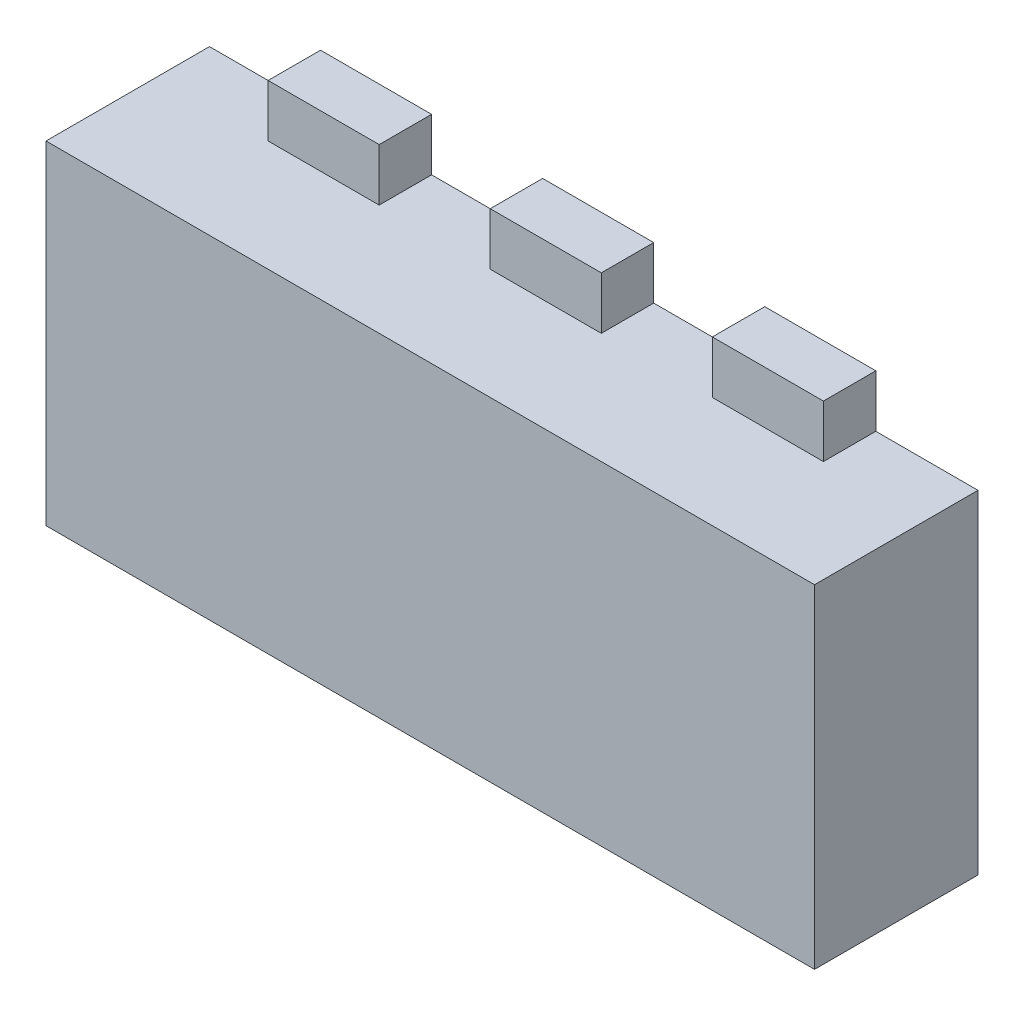
ISO-10303-21;
HEADER;
FILE_DESCRIPTION(('STEP AP214'),'2;1');
FILE_NAME('part.step','',(''),(''),'','','');
FILE_SCHEMA(('AUTOMOTIVE_DESIGN { 1 0 10303 214 1 1 1 1 }'));
ENDSEC;
DATA;
#1=APPLICATION_CONTEXT('core data for automotive mechanical design processes');
#2=APPLICATION_PROTOCOL_DEFINITION('international standard','automotive_design',2000,#1);
#3=PRODUCT_CONTEXT('',#1,'mechanical');
#4=PRODUCT('Part','Part','',(#3));
#5=PRODUCT_RELATED_PRODUCT_CATEGORY('part','',(#4));
#6=PRODUCT_DEFINITION_FORMATION('','',#4);
#7=PRODUCT_DEFINITION_CONTEXT('part definition',#1,'design');
#8=PRODUCT_DEFINITION('design','',#6,#7);
#9=PRODUCT_DEFINITION_SHAPE('','',#8);
#10=(LENGTH_UNIT() NAMED_UNIT(*) SI_UNIT(.MILLI.,.METRE.));
#11=(NAMED_UNIT(*) PLANE_ANGLE_UNIT() SI_UNIT($,.RADIAN.));
#12=(NAMED_UNIT(*) SI_UNIT($,.STERADIAN.) SOLID_ANGLE_UNIT());
#13=UNCERTAINTY_MEASURE_WITH_UNIT(LENGTH_MEASURE(1.E-05),#10,'distance_accuracy_value','');
#14=(GEOMETRIC_REPRESENTATION_CONTEXT(3) GLOBAL_UNCERTAINTY_ASSIGNED_CONTEXT((#13)) GLOBAL_UNIT_ASSIGNED_CONTEXT((#10,
#11,#12)) REPRESENTATION_CONTEXT('',''));
#15=CARTESIAN_POINT('',(0.,0.,0.));
#16=DIRECTION('',(0.,0.,1.));
#17=DIRECTION('',(1.,0.,0.));
#18=AXIS2_PLACEMENT_3D('',#15,#16,#17);
#19=CARTESIAN_POINT('',(0.,0.,2.9972));
#20=DIRECTION('',(0.,0.,-1.));
#21=DIRECTION('',(-1.,0.,0.));
#22=AXIS2_PLACEMENT_3D('',#19,#20,#21);
#23=PLANE('',#22);
#24=DIRECTION('',(-1.,0.,0.));
#25=VECTOR('',#24,1.);
#26=CARTESIAN_POINT('',(-21.971,9.525,2.9972));
#27=LINE('',#26,#25);
#28=CARTESIAN_POINT('',(16.129,9.525,2.9972));
#29=VERTEX_POINT('',#28);
#30=CARTESIAN_POINT('',(9.77899999999999,9.525,2.9972));
#31=VERTEX_POINT('',#30);
#32=EDGE_CURVE('E11',#29,#31,#27,.T.);
#33=ORIENTED_EDGE('',*,*,#32,.F.);
#34=DIRECTION('',(0.,-1.,0.));
#35=VECTOR('',#34,1.);
#36=CARTESIAN_POINT('',(16.129,12.5222,2.9972));
#37=LINE('',#36,#35);
#38=CARTESIAN_POINT('',(16.129,12.5222,2.9972));
#39=VERTEX_POINT('',#38);
#40=EDGE_CURVE('E397',#39,#29,#37,.T.);
#41=ORIENTED_EDGE('',*,*,#40,.F.);
#42=DIRECTION('',(1.,0.,0.));
#43=VECTOR('',#42,1.);
#44=CARTESIAN_POINT('',(9.779,12.5222,2.9972));
#45=LINE('',#44,#43);
#46=CARTESIAN_POINT('',(9.779,12.5222,2.9972));
#47=VERTEX_POINT('',#46);
#48=EDGE_CURVE('E380',#47,#39,#45,.T.);
#49=ORIENTED_EDGE('',*,*,#48,.F.);
#50=DIRECTION('',(0.,-1.,0.));
#51=VECTOR('',#50,1.);
#52=CARTESIAN_POINT('',(9.779,12.5222,2.9972));
#53=LINE('',#52,#51);
#54=EDGE_CURVE('E363',#47,#31,#53,.T.);
#55=ORIENTED_EDGE('',*,*,#54,.T.);
#56=EDGE_LOOP('',(#33,#41,#49,#55));
#57=FACE_BOUND('',#56,.T.);
#58=ADVANCED_FACE('F47',(#57),#23,.F.);
#59=CARTESIAN_POINT('',(3.42899999999999,9.525,2.9972));
#60=VERTEX_POINT('',#59);
#61=CARTESIAN_POINT('',(-2.92100000000001,9.525,2.9972));
#62=VERTEX_POINT('',#61);
#63=EDGE_CURVE('E56',#60,#62,#27,.T.);
#64=ORIENTED_EDGE('',*,*,#63,.F.);
#65=DIRECTION('',(0.,-1.,0.));
#66=VECTOR('',#65,1.);
#67=CARTESIAN_POINT('',(3.429,12.5222,2.9972));
#68=LINE('',#67,#66);
#69=CARTESIAN_POINT('',(3.429,12.5222,2.9972));
#70=VERTEX_POINT('',#69);
#71=EDGE_CURVE('E371',#70,#60,#68,.T.);
#72=ORIENTED_EDGE('',*,*,#71,.F.);
#73=DIRECTION('',(1.,0.,0.));
#74=VECTOR('',#73,1.);
#75=CARTESIAN_POINT('',(-2.921,12.5222,2.9972));
#76=LINE('',#75,#74);
#77=CARTESIAN_POINT('',(-2.921,12.5222,2.9972));
#78=VERTEX_POINT('',#77);
#79=EDGE_CURVE('E352',#78,#70,#76,.T.);
#80=ORIENTED_EDGE('',*,*,#79,.F.);
#81=DIRECTION('',(0.,-1.,0.));
#82=VECTOR('',#81,1.);
#83=CARTESIAN_POINT('',(-2.921,12.5222,2.9972));
#84=LINE('',#83,#82);
#85=EDGE_CURVE('E374',#78,#62,#84,.T.);
#86=ORIENTED_EDGE('',*,*,#85,.T.);
#87=EDGE_LOOP('',(#64,#72,#80,#86));
#88=FACE_BOUND('',#87,.T.);
#89=ADVANCED_FACE('F470',(#88),#23,.F.);
#90=CARTESIAN_POINT('',(-9.271,9.525,2.9972));
#91=VERTEX_POINT('',#90);
#92=CARTESIAN_POINT('',(-15.621,9.525,2.9972));
#93=VERTEX_POINT('',#92);
#94=EDGE_CURVE('E58',#91,#93,#27,.T.);
#95=ORIENTED_EDGE('',*,*,#94,.F.);
#96=DIRECTION('',(0.,-1.,0.));
#97=VECTOR('',#96,1.);
#98=CARTESIAN_POINT('',(-9.271,12.5222,2.9972));
#99=LINE('',#98,#97);
#100=CARTESIAN_POINT('',(-9.271,12.5222,2.9972));
#101=VERTEX_POINT('',#100);
#102=EDGE_CURVE('E421',#101,#91,#99,.T.);
#103=ORIENTED_EDGE('',*,*,#102,.F.);
#104=DIRECTION('',(1.,0.,0.));
#105=VECTOR('',#104,1.);
#106=CARTESIAN_POINT('',(-15.621,12.5222,2.9972));
#107=LINE('',#106,#105);
#108=CARTESIAN_POINT('',(-15.621,12.5222,2.9972));
#109=VERTEX_POINT('',#108);
#110=EDGE_CURVE('E404',#109,#101,#107,.T.);
#111=ORIENTED_EDGE('',*,*,#110,.F.);
#112=DIRECTION('',(0.,-1.,0.));
#113=VECTOR('',#112,1.);
#114=CARTESIAN_POINT('',(-15.621,12.5222,2.9972));
#115=LINE('',#114,#113);
#116=EDGE_CURVE('E424',#109,#93,#115,.T.);
#117=ORIENTED_EDGE('',*,*,#116,.T.);
#118=EDGE_LOOP('',(#95,#103,#111,#117));
#119=FACE_BOUND('',#118,.T.);
#120=ADVANCED_FACE('F479',(#119),#23,.F.);
#121=DIRECTION('',(1.,0.,0.));
#122=VECTOR('',#121,1.);
#123=CARTESIAN_POINT('',(-21.971,-9.525,2.9972));
#124=LINE('',#123,#122);
#125=CARTESIAN_POINT('',(-15.621,-9.525,2.9972));
#126=VERTEX_POINT('',#125);
#127=CARTESIAN_POINT('',(-9.271,-9.525,2.9972));
#128=VERTEX_POINT('',#127);
#129=EDGE_CURVE('E269',#126,#128,#124,.T.);
#130=ORIENTED_EDGE('',*,*,#129,.F.);
#131=DIRECTION('',(0.,1.,0.));
#132=VECTOR('',#131,1.);
#133=CARTESIAN_POINT('',(-15.621,-12.5222,2.9972));
#134=LINE('',#133,#132);
#135=CARTESIAN_POINT('',(-15.621,-12.5222,2.9972));
#136=VERTEX_POINT('',#135);
#137=EDGE_CURVE('E287',#136,#126,#134,.T.);
#138=ORIENTED_EDGE('',*,*,#137,.F.);
#139=DIRECTION('',(1.,0.,0.));
#140=VECTOR('',#139,1.);
#141=CARTESIAN_POINT('',(-15.621,-12.5222,2.9972));
#142=LINE('',#141,#140);
#143=CARTESIAN_POINT('',(-9.271,-12.5222,2.9972));
#144=VERTEX_POINT('',#143);
#145=EDGE_CURVE('E284',#136,#144,#142,.T.);
#146=ORIENTED_EDGE('',*,*,#145,.T.);
#147=DIRECTION('',(0.,1.,0.));
#148=VECTOR('',#147,1.);
#149=CARTESIAN_POINT('',(-9.271,-12.5222,2.9972));
#150=LINE('',#149,#148);
#151=EDGE_CURVE('E296',#144,#128,#150,.T.);
#152=ORIENTED_EDGE('',*,*,#151,.T.);
#153=EDGE_LOOP('',(#130,#138,#146,#152));
#154=FACE_BOUND('',#153,.T.);
#155=ADVANCED_FACE('F490',(#154),#23,.F.);
#156=CARTESIAN_POINT('',(-2.921,-9.525,2.9972));
#157=VERTEX_POINT('',#156);
#158=CARTESIAN_POINT('',(3.429,-9.525,2.9972));
#159=VERTEX_POINT('',#158);
#160=EDGE_CURVE('E271',#157,#159,#124,.T.);
#161=ORIENTED_EDGE('',*,*,#160,.F.);
#162=DIRECTION('',(0.,1.,0.));
#163=VECTOR('',#162,1.);
#164=CARTESIAN_POINT('',(-2.921,-12.5222,2.9972));
#165=LINE('',#164,#163);
#166=CARTESIAN_POINT('',(-2.921,-12.5222,2.9972));
#167=VERTEX_POINT('',#166);
#168=EDGE_CURVE('E315',#167,#157,#165,.T.);
#169=ORIENTED_EDGE('',*,*,#168,.F.);
#170=DIRECTION('',(1.,0.,0.));
#171=VECTOR('',#170,1.);
#172=CARTESIAN_POINT('',(-2.921,-12.5222,2.9972));
#173=LINE('',#172,#171);
#174=CARTESIAN_POINT('',(3.429,-12.5222,2.9972));
#175=VERTEX_POINT('',#174);
#176=EDGE_CURVE('E312',#167,#175,#173,.T.);
#177=ORIENTED_EDGE('',*,*,#176,.T.);
#178=DIRECTION('',(0.,1.,0.));
#179=VECTOR('',#178,1.);
#180=CARTESIAN_POINT('',(3.429,-12.5222,2.9972));
#181=LINE('',#180,#179);
#182=EDGE_CURVE('E323',#175,#159,#181,.T.);
#183=ORIENTED_EDGE('',*,*,#182,.T.);
#184=EDGE_LOOP('',(#161,#169,#177,#183));
#185=FACE_BOUND('',#184,.T.);
#186=ADVANCED_FACE('F448',(#185),#23,.F.);
#187=CARTESIAN_POINT('',(9.779,-9.525,2.9972));
#188=VERTEX_POINT('',#187);
#189=CARTESIAN_POINT('',(16.129,-9.525,2.9972));
#190=VERTEX_POINT('',#189);
#191=EDGE_CURVE('E272',#188,#190,#124,.T.);
#192=ORIENTED_EDGE('',*,*,#191,.F.);
#193=DIRECTION('',(0.,1.,0.));
#194=VECTOR('',#193,1.);
#195=CARTESIAN_POINT('',(9.779,-12.5222,2.9972));
#196=LINE('',#195,#194);
#197=CARTESIAN_POINT('',(9.779,-12.5222,2.9972));
#198=VERTEX_POINT('',#197);
#199=EDGE_CURVE('E339',#198,#188,#196,.T.);
#200=ORIENTED_EDGE('',*,*,#199,.F.);
#201=DIRECTION('',(1.,0.,0.));
#202=VECTOR('',#201,1.);
#203=CARTESIAN_POINT('',(9.779,-12.5222,2.9972));
#204=LINE('',#203,#202);
#205=CARTESIAN_POINT('',(16.129,-12.5222,2.9972));
#206=VERTEX_POINT('',#205);
#207=EDGE_CURVE('E336',#198,#206,#204,.T.);
#208=ORIENTED_EDGE('',*,*,#207,.T.);
#209=DIRECTION('',(0.,1.,0.));
#210=VECTOR('',#209,1.);
#211=CARTESIAN_POINT('',(16.129,-12.5222,2.9972));
#212=LINE('',#211,#210);
#213=EDGE_CURVE('E345',#206,#190,#212,.T.);
#214=ORIENTED_EDGE('',*,*,#213,.T.);
#215=EDGE_LOOP('',(#192,#200,#208,#214));
#216=FACE_BOUND('',#215,.T.);
#217=ADVANCED_FACE('F473',(#216),#23,.F.);
#218=CARTESIAN_POINT('',(-21.971,9.525,2.9972));
#219=DIRECTION('',(0.,-1.,0.));
#220=DIRECTION('',(0.,0.,-1.));
#221=AXIS2_PLACEMENT_3D('',#218,#219,#220);
#222=PLANE('',#221);
#223=DIRECTION('',(0.,0.,1.));
#224=VECTOR('',#223,1.);
#225=CARTESIAN_POINT('',(-15.621,9.525,0.));
#226=LINE('',#225,#224);
#227=CARTESIAN_POINT('',(-15.621,9.525,0.));
#228=VERTEX_POINT('',#227);
#229=EDGE_CURVE('E376',#228,#93,#226,.T.);
#230=ORIENTED_EDGE('',*,*,#229,.F.);
#231=DIRECTION('',(-1.,0.,0.));
#232=VECTOR('',#231,1.);
#233=CARTESIAN_POINT('',(-21.971,9.525,0.));
#234=LINE('',#233,#232);
#235=CARTESIAN_POINT('',(-21.971,9.525,0.));
#236=VERTEX_POINT('',#235);
#237=EDGE_CURVE('E429',#228,#236,#234,.T.);
#238=ORIENTED_EDGE('',*,*,#237,.T.);
#239=DIRECTION('',(0.,0.,-1.));
#240=VECTOR('',#239,1.);
#241=CARTESIAN_POINT('',(-21.971,9.525,2.9972));
#242=LINE('',#241,#240);
#243=CARTESIAN_POINT('',(-21.971,9.525,9.3472));
#244=VERTEX_POINT('',#243);
#245=EDGE_CURVE('E248',#244,#236,#242,.T.);
#246=ORIENTED_EDGE('',*,*,#245,.F.);
#247=DIRECTION('',(-1.,0.,0.));
#248=VECTOR('',#247,1.);
#249=CARTESIAN_POINT('',(-21.971,9.525,9.3472));
#250=LINE('',#249,#248);
#251=CARTESIAN_POINT('',(21.971,9.525,9.3472));
#252=VERTEX_POINT('',#251);
#253=EDGE_CURVE('E263',#252,#244,#250,.T.);
#254=ORIENTED_EDGE('',*,*,#253,.F.);
#255=DIRECTION('',(0.,0.,-1.));
#256=VECTOR('',#255,1.);
#257=CARTESIAN_POINT('',(21.971,9.525,2.9972));
#258=LINE('',#257,#256);
#259=CARTESIAN_POINT('',(21.971,9.525,0.));
#260=VERTEX_POINT('',#259);
#261=EDGE_CURVE('E51',#252,#260,#258,.T.);
#262=ORIENTED_EDGE('',*,*,#261,.T.);
#263=CARTESIAN_POINT('',(16.129,9.525,0.));
#264=VERTEX_POINT('',#263);
#265=EDGE_CURVE('E430',#260,#264,#234,.T.);
#266=ORIENTED_EDGE('',*,*,#265,.T.);
#267=DIRECTION('',(0.,0.,-1.));
#268=VECTOR('',#267,1.);
#269=CARTESIAN_POINT('',(16.129,9.525,0.));
#270=LINE('',#269,#268);
#271=EDGE_CURVE('E381',#29,#264,#270,.T.);
#272=ORIENTED_EDGE('',*,*,#271,.F.);
#273=ORIENTED_EDGE('',*,*,#32,.T.);
#274=DIRECTION('',(0.,0.,1.));
#275=VECTOR('',#274,1.);
#276=CARTESIAN_POINT('',(9.779,9.525,0.));
#277=LINE('',#276,#275);
#278=CARTESIAN_POINT('',(9.779,9.525,0.));
#279=VERTEX_POINT('',#278);
#280=EDGE_CURVE('E302',#279,#31,#277,.T.);
#281=ORIENTED_EDGE('',*,*,#280,.F.);
#282=CARTESIAN_POINT('',(3.42899999999999,9.525,0.));
#283=VERTEX_POINT('',#282);
#284=EDGE_CURVE('E432',#279,#283,#234,.T.);
#285=ORIENTED_EDGE('',*,*,#284,.T.);
#286=DIRECTION('',(0.,0.,-1.));
#287=VECTOR('',#286,1.);
#288=CARTESIAN_POINT('',(3.429,9.525,0.));
#289=LINE('',#288,#287);
#290=EDGE_CURVE('E353',#60,#283,#289,.T.);
#291=ORIENTED_EDGE('',*,*,#290,.F.);
#292=ORIENTED_EDGE('',*,*,#63,.T.);
#293=DIRECTION('',(0.,0.,1.));
#294=VECTOR('',#293,1.);
#295=CARTESIAN_POINT('',(-2.921,9.525,0.));
#296=LINE('',#295,#294);
#297=CARTESIAN_POINT('',(-2.921,9.525,0.));
#298=VERTEX_POINT('',#297);
#299=EDGE_CURVE('E360',#298,#62,#296,.T.);
#300=ORIENTED_EDGE('',*,*,#299,.F.);
#301=CARTESIAN_POINT('',(-9.271,9.525,0.));
#302=VERTEX_POINT('',#301);
#303=EDGE_CURVE('E433',#298,#302,#234,.T.);
#304=ORIENTED_EDGE('',*,*,#303,.T.);
#305=DIRECTION('',(0.,0.,-1.));
#306=VECTOR('',#305,1.);
#307=CARTESIAN_POINT('',(-9.271,9.525,0.));
#308=LINE('',#307,#306);
#309=EDGE_CURVE('E405',#91,#302,#308,.T.);
#310=ORIENTED_EDGE('',*,*,#309,.F.);
#311=ORIENTED_EDGE('',*,*,#94,.T.);
#312=EDGE_LOOP('',(#230,#238,#246,#254,#262,#266,#272,#273,#281,#285,#291,#292,#300,#304,#310,#311));
#313=FACE_BOUND('',#312,.T.);
#314=ADVANCED_FACE('F484',(#313),#222,.F.);
#315=CARTESIAN_POINT('',(21.971,-9.525,2.9972));
#316=DIRECTION('',(-1.,0.,0.));
#317=DIRECTION('',(0.,0.,1.));
#318=AXIS2_PLACEMENT_3D('',#315,#316,#317);
#319=PLANE('',#318);
#320=DIRECTION('',(0.,1.,0.));
#321=VECTOR('',#320,1.);
#322=CARTESIAN_POINT('',(21.971,-9.525,0.));
#323=LINE('',#322,#321);
#324=CARTESIAN_POINT('',(21.971,-9.525,0.));
#325=VERTEX_POINT('',#324);
#326=EDGE_CURVE('E426',#325,#260,#323,.T.);
#327=ORIENTED_EDGE('',*,*,#326,.T.);
#328=ORIENTED_EDGE('',*,*,#261,.F.);
#329=DIRECTION('',(0.,1.,0.));
#330=VECTOR('',#329,1.);
#331=CARTESIAN_POINT('',(21.971,9.525,9.3472));
#332=LINE('',#331,#330);
#333=CARTESIAN_POINT('',(21.971,-9.525,9.3472));
#334=VERTEX_POINT('',#333);
#335=EDGE_CURVE('E258',#334,#252,#332,.T.);
#336=ORIENTED_EDGE('',*,*,#335,.F.);
#337=DIRECTION('',(0.,0.,-1.));
#338=VECTOR('',#337,1.);
#339=CARTESIAN_POINT('',(21.971,-9.525,2.9972));
#340=LINE('',#339,#338);
#341=EDGE_CURVE('E249',#334,#325,#340,.T.);
#342=ORIENTED_EDGE('',*,*,#341,.T.);
#343=EDGE_LOOP('',(#327,#328,#336,#342));
#344=FACE_BOUND('',#343,.T.);
#345=ADVANCED_FACE('F49',(#344),#319,.F.);
#346=CARTESIAN_POINT('',(-21.971,-9.525,2.9972));
#347=DIRECTION('',(1.,0.,0.));
#348=DIRECTION('',(0.,0.,-1.));
#349=AXIS2_PLACEMENT_3D('',#346,#347,#348);
#350=PLANE('',#349);
#351=DIRECTION('',(0.,-1.,0.));
#352=VECTOR('',#351,1.);
#353=CARTESIAN_POINT('',(-21.971,-9.525,0.));
#354=LINE('',#353,#352);
#355=CARTESIAN_POINT('',(-21.971,-9.525,0.));
#356=VERTEX_POINT('',#355);
#357=EDGE_CURVE('E244',#236,#356,#354,.T.);
#358=ORIENTED_EDGE('',*,*,#357,.T.);
#359=DIRECTION('',(0.,0.,-1.));
#360=VECTOR('',#359,1.);
#361=CARTESIAN_POINT('',(-21.971,-9.525,2.9972));
#362=LINE('',#361,#360);
#363=CARTESIAN_POINT('',(-21.971,-9.525,9.3472));
#364=VERTEX_POINT('',#363);
#365=EDGE_CURVE('E237',#364,#356,#362,.T.);
#366=ORIENTED_EDGE('',*,*,#365,.F.);
#367=DIRECTION('',(0.,-1.,0.));
#368=VECTOR('',#367,1.);
#369=CARTESIAN_POINT('',(-21.971,9.525,9.3472));
#370=LINE('',#369,#368);
#371=EDGE_CURVE('E242',#244,#364,#370,.T.);
#372=ORIENTED_EDGE('',*,*,#371,.F.);
#373=ORIENTED_EDGE('',*,*,#245,.T.);
#374=EDGE_LOOP('',(#358,#366,#372,#373));
#375=FACE_BOUND('',#374,.T.);
#376=ADVANCED_FACE('F239',(#375),#350,.F.);
#377=CARTESIAN_POINT('',(-21.971,-9.525,2.9972));
#378=DIRECTION('',(0.,1.,0.));
#379=DIRECTION('',(0.,0.,1.));
#380=AXIS2_PLACEMENT_3D('',#377,#378,#379);
#381=PLANE('',#380);
#382=ORIENTED_EDGE('',*,*,#341,.F.);
#383=DIRECTION('',(1.,0.,0.));
#384=VECTOR('',#383,1.);
#385=CARTESIAN_POINT('',(-21.971,-9.525,9.3472));
#386=LINE('',#385,#384);
#387=EDGE_CURVE('E252',#364,#334,#386,.T.);
#388=ORIENTED_EDGE('',*,*,#387,.F.);
#389=ORIENTED_EDGE('',*,*,#365,.T.);
#390=DIRECTION('',(1.,0.,0.));
#391=VECTOR('',#390,1.);
#392=CARTESIAN_POINT('',(-21.971,-9.525,0.));
#393=LINE('',#392,#391);
#394=CARTESIAN_POINT('',(-15.621,-9.525,0.));
#395=VERTEX_POINT('',#394);
#396=EDGE_CURVE('E436',#356,#395,#393,.T.);
#397=ORIENTED_EDGE('',*,*,#396,.T.);
#398=DIRECTION('',(0.,0.,1.));
#399=VECTOR('',#398,1.);
#400=CARTESIAN_POINT('',(-15.621,-9.525,0.));
#401=LINE('',#400,#399);
#402=EDGE_CURVE('E288',#395,#126,#401,.T.);
#403=ORIENTED_EDGE('',*,*,#402,.T.);
#404=ORIENTED_EDGE('',*,*,#129,.T.);
#405=DIRECTION('',(0.,0.,-1.));
#406=VECTOR('',#405,1.);
#407=CARTESIAN_POINT('',(-9.271,-9.525,0.));
#408=LINE('',#407,#406);
#409=CARTESIAN_POINT('',(-9.271,-9.525,0.));
#410=VERTEX_POINT('',#409);
#411=EDGE_CURVE('E278',#128,#410,#408,.T.);
#412=ORIENTED_EDGE('',*,*,#411,.T.);
#413=CARTESIAN_POINT('',(-2.921,-9.525,0.));
#414=VERTEX_POINT('',#413);
#415=EDGE_CURVE('E438',#410,#414,#393,.T.);
#416=ORIENTED_EDGE('',*,*,#415,.T.);
#417=DIRECTION('',(0.,0.,1.));
#418=VECTOR('',#417,1.);
#419=CARTESIAN_POINT('',(-2.921,-9.525,0.));
#420=LINE('',#419,#418);
#421=EDGE_CURVE('E316',#414,#157,#420,.T.);
#422=ORIENTED_EDGE('',*,*,#421,.T.);
#423=ORIENTED_EDGE('',*,*,#160,.T.);
#424=DIRECTION('',(0.,0.,-1.));
#425=VECTOR('',#424,1.);
#426=CARTESIAN_POINT('',(3.429,-9.525,0.));
#427=LINE('',#426,#425);
#428=CARTESIAN_POINT('',(3.42899999999999,-9.525,0.));
#429=VERTEX_POINT('',#428);
#430=EDGE_CURVE('E307',#159,#429,#427,.T.);
#431=ORIENTED_EDGE('',*,*,#430,.T.);
#432=CARTESIAN_POINT('',(9.779,-9.525,0.));
#433=VERTEX_POINT('',#432);
#434=EDGE_CURVE('E496',#429,#433,#393,.T.);
#435=ORIENTED_EDGE('',*,*,#434,.T.);
#436=DIRECTION('',(0.,0.,1.));
#437=VECTOR('',#436,1.);
#438=CARTESIAN_POINT('',(9.779,-9.525,0.));
#439=LINE('',#438,#437);
#440=EDGE_CURVE('E268',#433,#188,#439,.T.);
#441=ORIENTED_EDGE('',*,*,#440,.T.);
#442=ORIENTED_EDGE('',*,*,#191,.T.);
#443=DIRECTION('',(0.,0.,-1.));
#444=VECTOR('',#443,1.);
#445=CARTESIAN_POINT('',(16.129,-9.525,0.));
#446=LINE('',#445,#444);
#447=CARTESIAN_POINT('',(16.129,-9.525,0.));
#448=VERTEX_POINT('',#447);
#449=EDGE_CURVE('E331',#190,#448,#446,.T.);
#450=ORIENTED_EDGE('',*,*,#449,.T.);
#451=EDGE_CURVE('E435',#448,#325,#393,.T.);
#452=ORIENTED_EDGE('',*,*,#451,.T.);
#453=EDGE_LOOP('',(#382,#388,#389,#397,#403,#404,#412,#416,#422,#423,#431,#435,#441,#442,#450,#452));
#454=FACE_BOUND('',#453,.T.);
#455=ADVANCED_FACE('F253',(#454),#381,.F.);
#456=CARTESIAN_POINT('',(0.,0.,0.));
#457=DIRECTION('',(0.,0.,-1.));
#458=DIRECTION('',(-1.,0.,0.));
#459=AXIS2_PLACEMENT_3D('',#456,#457,#458);
#460=PLANE('',#459);
#461=ORIENTED_EDGE('',*,*,#326,.F.);
#462=ORIENTED_EDGE('',*,*,#451,.F.);
#463=DIRECTION('',(0.,1.,0.));
#464=VECTOR('',#463,1.);
#465=CARTESIAN_POINT('',(16.129,-12.5222,0.));
#466=LINE('',#465,#464);
#467=CARTESIAN_POINT('',(16.129,-12.5222,0.));
#468=VERTEX_POINT('',#467);
#469=EDGE_CURVE('E65',#468,#448,#466,.T.);
#470=ORIENTED_EDGE('',*,*,#469,.F.);
#471=DIRECTION('',(-1.,0.,0.));
#472=VECTOR('',#471,1.);
#473=CARTESIAN_POINT('',(9.779,-12.5222,0.));
#474=LINE('',#473,#472);
#475=CARTESIAN_POINT('',(9.779,-12.5222,0.));
#476=VERTEX_POINT('',#475);
#477=EDGE_CURVE('E330',#468,#476,#474,.T.);
#478=ORIENTED_EDGE('',*,*,#477,.T.);
#479=DIRECTION('',(0.,1.,0.));
#480=VECTOR('',#479,1.);
#481=CARTESIAN_POINT('',(9.779,-12.5222,0.));
#482=LINE('',#481,#480);
#483=EDGE_CURVE('E319',#476,#433,#482,.T.);
#484=ORIENTED_EDGE('',*,*,#483,.T.);
#485=ORIENTED_EDGE('',*,*,#434,.F.);
#486=DIRECTION('',(0.,1.,0.));
#487=VECTOR('',#486,1.);
#488=CARTESIAN_POINT('',(3.429,-12.5222,0.));
#489=LINE('',#488,#487);
#490=CARTESIAN_POINT('',(3.429,-12.5222,0.));
#491=VERTEX_POINT('',#490);
#492=EDGE_CURVE('E73',#491,#429,#489,.T.);
#493=ORIENTED_EDGE('',*,*,#492,.F.);
#494=DIRECTION('',(-1.,0.,0.));
#495=VECTOR('',#494,1.);
#496=CARTESIAN_POINT('',(-2.921,-12.5222,0.));
#497=LINE('',#496,#495);
#498=CARTESIAN_POINT('',(-2.921,-12.5222,0.));
#499=VERTEX_POINT('',#498);
#500=EDGE_CURVE('E306',#491,#499,#497,.T.);
#501=ORIENTED_EDGE('',*,*,#500,.T.);
#502=DIRECTION('',(0.,1.,0.));
#503=VECTOR('',#502,1.);
#504=CARTESIAN_POINT('',(-2.921,-12.5222,0.));
#505=LINE('',#504,#503);
#506=EDGE_CURVE('E291',#499,#414,#505,.T.);
#507=ORIENTED_EDGE('',*,*,#506,.T.);
#508=ORIENTED_EDGE('',*,*,#415,.F.);
#509=DIRECTION('',(0.,1.,0.));
#510=VECTOR('',#509,1.);
#511=CARTESIAN_POINT('',(-9.271,-12.5222,0.));
#512=LINE('',#511,#510);
#513=CARTESIAN_POINT('',(-9.271,-12.5222,0.));
#514=VERTEX_POINT('',#513);
#515=EDGE_CURVE('E298',#514,#410,#512,.T.);
#516=ORIENTED_EDGE('',*,*,#515,.F.);
#517=DIRECTION('',(-1.,0.,0.));
#518=VECTOR('',#517,1.);
#519=CARTESIAN_POINT('',(-15.621,-12.5222,0.));
#520=LINE('',#519,#518);
#521=CARTESIAN_POINT('',(-15.621,-12.5222,0.));
#522=VERTEX_POINT('',#521);
#523=EDGE_CURVE('E277',#514,#522,#520,.T.);
#524=ORIENTED_EDGE('',*,*,#523,.T.);
#525=DIRECTION('',(0.,1.,0.));
#526=VECTOR('',#525,1.);
#527=CARTESIAN_POINT('',(-15.621,-12.5222,0.));
#528=LINE('',#527,#526);
#529=EDGE_CURVE('E300',#522,#395,#528,.T.);
#530=ORIENTED_EDGE('',*,*,#529,.T.);
#531=ORIENTED_EDGE('',*,*,#396,.F.);
#532=ORIENTED_EDGE('',*,*,#357,.F.);
#533=ORIENTED_EDGE('',*,*,#237,.F.);
#534=DIRECTION('',(0.,-1.,0.));
#535=VECTOR('',#534,1.);
#536=CARTESIAN_POINT('',(-15.621,12.5222,0.));
#537=LINE('',#536,#535);
#538=CARTESIAN_POINT('',(-15.621,12.5222,0.));
#539=VERTEX_POINT('',#538);
#540=EDGE_CURVE('E411',#539,#228,#537,.T.);
#541=ORIENTED_EDGE('',*,*,#540,.F.);
#542=DIRECTION('',(-1.,0.,0.));
#543=VECTOR('',#542,1.);
#544=CARTESIAN_POINT('',(-15.621,12.5222,0.));
#545=LINE('',#544,#543);
#546=CARTESIAN_POINT('',(-9.271,12.5222,0.));
#547=VERTEX_POINT('',#546);
#548=EDGE_CURVE('E409',#547,#539,#545,.T.);
#549=ORIENTED_EDGE('',*,*,#548,.F.);
#550=DIRECTION('',(0.,-1.,0.));
#551=VECTOR('',#550,1.);
#552=CARTESIAN_POINT('',(-9.271,12.5222,0.));
#553=LINE('',#552,#551);
#554=EDGE_CURVE('E418',#547,#302,#553,.T.);
#555=ORIENTED_EDGE('',*,*,#554,.T.);
#556=ORIENTED_EDGE('',*,*,#303,.F.);
#557=DIRECTION('',(0.,-1.,0.));
#558=VECTOR('',#557,1.);
#559=CARTESIAN_POINT('',(-2.921,12.5222,0.));
#560=LINE('',#559,#558);
#561=CARTESIAN_POINT('',(-2.921,12.5222,0.));
#562=VERTEX_POINT('',#561);
#563=EDGE_CURVE('E359',#562,#298,#560,.T.);
#564=ORIENTED_EDGE('',*,*,#563,.F.);
#565=DIRECTION('',(-1.,0.,0.));
#566=VECTOR('',#565,1.);
#567=CARTESIAN_POINT('',(-2.921,12.5222,0.));
#568=LINE('',#567,#566);
#569=CARTESIAN_POINT('',(3.429,12.5222,0.));
#570=VERTEX_POINT('',#569);
#571=EDGE_CURVE('E357',#570,#562,#568,.T.);
#572=ORIENTED_EDGE('',*,*,#571,.F.);
#573=DIRECTION('',(0.,-1.,0.));
#574=VECTOR('',#573,1.);
#575=CARTESIAN_POINT('',(3.429,12.5222,0.));
#576=LINE('',#575,#574);
#577=EDGE_CURVE('E368',#570,#283,#576,.T.);
#578=ORIENTED_EDGE('',*,*,#577,.T.);
#579=ORIENTED_EDGE('',*,*,#284,.F.);
#580=DIRECTION('',(0.,-1.,0.));
#581=VECTOR('',#580,1.);
#582=CARTESIAN_POINT('',(9.779,12.5222,0.));
#583=LINE('',#582,#581);
#584=CARTESIAN_POINT('',(9.779,12.5222,0.));
#585=VERTEX_POINT('',#584);
#586=EDGE_CURVE('E387',#585,#279,#583,.T.);
#587=ORIENTED_EDGE('',*,*,#586,.F.);
#588=DIRECTION('',(-1.,0.,0.));
#589=VECTOR('',#588,1.);
#590=CARTESIAN_POINT('',(9.779,12.5222,0.));
#591=LINE('',#590,#589);
#592=CARTESIAN_POINT('',(16.129,12.5222,0.));
#593=VERTEX_POINT('',#592);
#594=EDGE_CURVE('E385',#593,#585,#591,.T.);
#595=ORIENTED_EDGE('',*,*,#594,.F.);
#596=DIRECTION('',(0.,-1.,0.));
#597=VECTOR('',#596,1.);
#598=CARTESIAN_POINT('',(16.129,12.5222,0.));
#599=LINE('',#598,#597);
#600=EDGE_CURVE('E394',#593,#264,#599,.T.);
#601=ORIENTED_EDGE('',*,*,#600,.T.);
#602=ORIENTED_EDGE('',*,*,#265,.F.);
#603=EDGE_LOOP('',(#461,#462,#470,#478,#484,#485,#493,#501,#507,#508,#516,#524,#530,#531,#532,
#533,#541,#549,#555,#556,#564,#572,#578,#579,#587,#595,#601,#602));
#604=FACE_BOUND('',#603,.T.);
#605=ADVANCED_FACE('F501',(#604),#460,.T.);
#606=CARTESIAN_POINT('',(-15.621,12.5222,0.));
#607=DIRECTION('',(1.,0.,0.));
#608=DIRECTION('',(0.,0.,-1.));
#609=AXIS2_PLACEMENT_3D('',#606,#607,#608);
#610=PLANE('',#609);
#611=ORIENTED_EDGE('',*,*,#229,.T.);
#612=ORIENTED_EDGE('',*,*,#116,.F.);
#613=DIRECTION('',(0.,0.,1.));
#614=VECTOR('',#613,1.);
#615=CARTESIAN_POINT('',(-15.621,12.5222,0.));
#616=LINE('',#615,#614);
#617=EDGE_CURVE('E401',#539,#109,#616,.T.);
#618=ORIENTED_EDGE('',*,*,#617,.F.);
#619=ORIENTED_EDGE('',*,*,#540,.T.);
#620=EDGE_LOOP('',(#611,#612,#618,#619));
#621=FACE_BOUND('',#620,.T.);
#622=ADVANCED_FACE('F524',(#621),#610,.F.);
#623=CARTESIAN_POINT('',(-9.271,12.5222,0.));
#624=DIRECTION('',(-1.,0.,0.));
#625=DIRECTION('',(0.,0.,1.));
#626=AXIS2_PLACEMENT_3D('',#623,#624,#625);
#627=PLANE('',#626);
#628=ORIENTED_EDGE('',*,*,#309,.T.);
#629=ORIENTED_EDGE('',*,*,#554,.F.);
#630=DIRECTION('',(0.,0.,-1.));
#631=VECTOR('',#630,1.);
#632=CARTESIAN_POINT('',(-9.271,12.5222,0.));
#633=LINE('',#632,#631);
#634=EDGE_CURVE('E407',#101,#547,#633,.T.);
#635=ORIENTED_EDGE('',*,*,#634,.F.);
#636=ORIENTED_EDGE('',*,*,#102,.T.);
#637=EDGE_LOOP('',(#628,#629,#635,#636));
#638=FACE_BOUND('',#637,.T.);
#639=ADVANCED_FACE('F534',(#638),#627,.F.);
#640=CARTESIAN_POINT('',(0.,12.5222,0.));
#641=DIRECTION('',(0.,1.,0.));
#642=DIRECTION('',(0.,0.,1.));
#643=AXIS2_PLACEMENT_3D('',#640,#641,#642);
#644=PLANE('',#643);
#645=ORIENTED_EDGE('',*,*,#617,.T.);
#646=ORIENTED_EDGE('',*,*,#110,.T.);
#647=ORIENTED_EDGE('',*,*,#634,.T.);
#648=ORIENTED_EDGE('',*,*,#548,.T.);
#649=EDGE_LOOP('',(#645,#646,#647,#648));
#650=FACE_BOUND('',#649,.T.);
#651=ADVANCED_FACE('F527',(#650),#644,.T.);
#652=CARTESIAN_POINT('',(9.779,12.5222,0.));
#653=DIRECTION('',(1.,0.,0.));
#654=DIRECTION('',(0.,0.,-1.));
#655=AXIS2_PLACEMENT_3D('',#652,#653,#654);
#656=PLANE('',#655);
#657=ORIENTED_EDGE('',*,*,#280,.T.);
#658=ORIENTED_EDGE('',*,*,#54,.F.);
#659=DIRECTION('',(0.,0.,1.));
#660=VECTOR('',#659,1.);
#661=CARTESIAN_POINT('',(9.779,12.5222,0.));
#662=LINE('',#661,#660);
#663=EDGE_CURVE('E377',#585,#47,#662,.T.);
#664=ORIENTED_EDGE('',*,*,#663,.F.);
#665=ORIENTED_EDGE('',*,*,#586,.T.);
#666=EDGE_LOOP('',(#657,#658,#664,#665));
#667=FACE_BOUND('',#666,.T.);
#668=ADVANCED_FACE('F515',(#667),#656,.F.);
#669=CARTESIAN_POINT('',(16.129,12.5222,0.));
#670=DIRECTION('',(-1.,0.,0.));
#671=DIRECTION('',(0.,0.,1.));
#672=AXIS2_PLACEMENT_3D('',#669,#670,#671);
#673=PLANE('',#672);
#674=ORIENTED_EDGE('',*,*,#271,.T.);
#675=ORIENTED_EDGE('',*,*,#600,.F.);
#676=DIRECTION('',(0.,0.,-1.));
#677=VECTOR('',#676,1.);
#678=CARTESIAN_POINT('',(16.129,12.5222,0.));
#679=LINE('',#678,#677);
#680=EDGE_CURVE('E383',#39,#593,#679,.T.);
#681=ORIENTED_EDGE('',*,*,#680,.F.);
#682=ORIENTED_EDGE('',*,*,#40,.T.);
#683=EDGE_LOOP('',(#674,#675,#681,#682));
#684=FACE_BOUND('',#683,.T.);
#685=ADVANCED_FACE('F506',(#684),#673,.F.);
#686=CARTESIAN_POINT('',(25.4,12.5222,0.));
#687=DIRECTION('',(0.,1.,0.));
#688=DIRECTION('',(0.,0.,1.));
#689=AXIS2_PLACEMENT_3D('',#686,#687,#688);
#690=PLANE('',#689);
#691=ORIENTED_EDGE('',*,*,#663,.T.);
#692=ORIENTED_EDGE('',*,*,#48,.T.);
#693=ORIENTED_EDGE('',*,*,#680,.T.);
#694=ORIENTED_EDGE('',*,*,#594,.T.);
#695=EDGE_LOOP('',(#691,#692,#693,#694));
#696=FACE_BOUND('',#695,.T.);
#697=ADVANCED_FACE('F555',(#696),#690,.T.);
#698=CARTESIAN_POINT('',(-2.921,12.5222,0.));
#699=DIRECTION('',(1.,0.,0.));
#700=DIRECTION('',(0.,0.,-1.));
#701=AXIS2_PLACEMENT_3D('',#698,#699,#700);
#702=PLANE('',#701);
#703=ORIENTED_EDGE('',*,*,#299,.T.);
#704=ORIENTED_EDGE('',*,*,#85,.F.);
#705=DIRECTION('',(0.,0.,1.));
#706=VECTOR('',#705,1.);
#707=CARTESIAN_POINT('',(-2.921,12.5222,0.));
#708=LINE('',#707,#706);
#709=EDGE_CURVE('E349',#562,#78,#708,.T.);
#710=ORIENTED_EDGE('',*,*,#709,.F.);
#711=ORIENTED_EDGE('',*,*,#563,.T.);
#712=EDGE_LOOP('',(#703,#704,#710,#711));
#713=FACE_BOUND('',#712,.T.);
#714=ADVANCED_FACE('F540',(#713),#702,.F.);
#715=CARTESIAN_POINT('',(3.429,12.5222,0.));
#716=DIRECTION('',(-1.,0.,0.));
#717=DIRECTION('',(0.,0.,1.));
#718=AXIS2_PLACEMENT_3D('',#715,#716,#717);
#719=PLANE('',#718);
#720=ORIENTED_EDGE('',*,*,#290,.T.);
#721=ORIENTED_EDGE('',*,*,#577,.F.);
#722=DIRECTION('',(0.,0.,-1.));
#723=VECTOR('',#722,1.);
#724=CARTESIAN_POINT('',(3.429,12.5222,0.));
#725=LINE('',#724,#723);
#726=EDGE_CURVE('E355',#70,#570,#725,.T.);
#727=ORIENTED_EDGE('',*,*,#726,.F.);
#728=ORIENTED_EDGE('',*,*,#71,.T.);
#729=EDGE_LOOP('',(#720,#721,#727,#728));
#730=FACE_BOUND('',#729,.T.);
#731=ADVANCED_FACE('F546',(#730),#719,.F.);
#732=CARTESIAN_POINT('',(12.7,12.5222,0.));
#733=DIRECTION('',(0.,1.,0.));
#734=DIRECTION('',(0.,0.,1.));
#735=AXIS2_PLACEMENT_3D('',#732,#733,#734);
#736=PLANE('',#735);
#737=ORIENTED_EDGE('',*,*,#709,.T.);
#738=ORIENTED_EDGE('',*,*,#79,.T.);
#739=ORIENTED_EDGE('',*,*,#726,.T.);
#740=ORIENTED_EDGE('',*,*,#571,.T.);
#741=EDGE_LOOP('',(#737,#738,#739,#740));
#742=FACE_BOUND('',#741,.T.);
#743=ADVANCED_FACE('F542',(#742),#736,.T.);
#744=CARTESIAN_POINT('',(9.779,-12.5222,0.));
#745=DIRECTION('',(-1.,0.,0.));
#746=DIRECTION('',(0.,0.,1.));
#747=AXIS2_PLACEMENT_3D('',#744,#745,#746);
#748=PLANE('',#747);
#749=ORIENTED_EDGE('',*,*,#440,.F.);
#750=ORIENTED_EDGE('',*,*,#483,.F.);
#751=DIRECTION('',(0.,0.,1.));
#752=VECTOR('',#751,1.);
#753=CARTESIAN_POINT('',(9.779,-12.5222,0.));
#754=LINE('',#753,#752);
#755=EDGE_CURVE('E327',#476,#198,#754,.T.);
#756=ORIENTED_EDGE('',*,*,#755,.T.);
#757=ORIENTED_EDGE('',*,*,#199,.T.);
#758=EDGE_LOOP('',(#749,#750,#756,#757));
#759=FACE_BOUND('',#758,.T.);
#760=ADVANCED_FACE('F493',(#759),#748,.T.);
#761=CARTESIAN_POINT('',(16.129,-12.5222,0.));
#762=DIRECTION('',(1.,0.,0.));
#763=DIRECTION('',(0.,0.,-1.));
#764=AXIS2_PLACEMENT_3D('',#761,#762,#763);
#765=PLANE('',#764);
#766=ORIENTED_EDGE('',*,*,#449,.F.);
#767=ORIENTED_EDGE('',*,*,#213,.F.);
#768=DIRECTION('',(0.,0.,-1.));
#769=VECTOR('',#768,1.);
#770=CARTESIAN_POINT('',(16.129,-12.5222,0.));
#771=LINE('',#770,#769);
#772=EDGE_CURVE('E334',#206,#468,#771,.T.);
#773=ORIENTED_EDGE('',*,*,#772,.T.);
#774=ORIENTED_EDGE('',*,*,#469,.T.);
#775=EDGE_LOOP('',(#766,#767,#773,#774));
#776=FACE_BOUND('',#775,.T.);
#777=ADVANCED_FACE('F660',(#776),#765,.T.);
#778=CARTESIAN_POINT('',(25.4,-12.5222,0.));
#779=DIRECTION('',(0.,-1.,0.));
#780=DIRECTION('',(0.,0.,1.));
#781=AXIS2_PLACEMENT_3D('',#778,#779,#780);
#782=PLANE('',#781);
#783=ORIENTED_EDGE('',*,*,#755,.F.);
#784=ORIENTED_EDGE('',*,*,#477,.F.);
#785=ORIENTED_EDGE('',*,*,#772,.F.);
#786=ORIENTED_EDGE('',*,*,#207,.F.);
#787=EDGE_LOOP('',(#783,#784,#785,#786));
#788=FACE_BOUND('',#787,.T.);
#789=ADVANCED_FACE('F467',(#788),#782,.T.);
#790=CARTESIAN_POINT('',(-2.921,-12.5222,0.));
#791=DIRECTION('',(-1.,0.,0.));
#792=DIRECTION('',(0.,0.,1.));
#793=AXIS2_PLACEMENT_3D('',#790,#791,#792);
#794=PLANE('',#793);
#795=ORIENTED_EDGE('',*,*,#421,.F.);
#796=ORIENTED_EDGE('',*,*,#506,.F.);
#797=DIRECTION('',(0.,0.,1.));
#798=VECTOR('',#797,1.);
#799=CARTESIAN_POINT('',(-2.921,-12.5222,0.));
#800=LINE('',#799,#798);
#801=EDGE_CURVE('E303',#499,#167,#800,.T.);
#802=ORIENTED_EDGE('',*,*,#801,.T.);
#803=ORIENTED_EDGE('',*,*,#168,.T.);
#804=EDGE_LOOP('',(#795,#796,#802,#803));
#805=FACE_BOUND('',#804,.T.);
#806=ADVANCED_FACE('F450',(#805),#794,.T.);
#807=CARTESIAN_POINT('',(3.429,-12.5222,0.));
#808=DIRECTION('',(1.,0.,0.));
#809=DIRECTION('',(0.,0.,-1.));
#810=AXIS2_PLACEMENT_3D('',#807,#808,#809);
#811=PLANE('',#810);
#812=ORIENTED_EDGE('',*,*,#430,.F.);
#813=ORIENTED_EDGE('',*,*,#182,.F.);
#814=DIRECTION('',(0.,0.,-1.));
#815=VECTOR('',#814,1.);
#816=CARTESIAN_POINT('',(3.429,-12.5222,0.));
#817=LINE('',#816,#815);
#818=EDGE_CURVE('E310',#175,#491,#817,.T.);
#819=ORIENTED_EDGE('',*,*,#818,.T.);
#820=ORIENTED_EDGE('',*,*,#492,.T.);
#821=EDGE_LOOP('',(#812,#813,#819,#820));
#822=FACE_BOUND('',#821,.T.);
#823=ADVANCED_FACE('F457',(#822),#811,.T.);
#824=CARTESIAN_POINT('',(12.7,-12.5222,0.));
#825=DIRECTION('',(0.,-1.,0.));
#826=DIRECTION('',(0.,0.,1.));
#827=AXIS2_PLACEMENT_3D('',#824,#825,#826);
#828=PLANE('',#827);
#829=ORIENTED_EDGE('',*,*,#801,.F.);
#830=ORIENTED_EDGE('',*,*,#500,.F.);
#831=ORIENTED_EDGE('',*,*,#818,.F.);
#832=ORIENTED_EDGE('',*,*,#176,.F.);
#833=EDGE_LOOP('',(#829,#830,#831,#832));
#834=FACE_BOUND('',#833,.T.);
#835=ADVANCED_FACE('F456',(#834),#828,.T.);
#836=CARTESIAN_POINT('',(-15.621,-12.5222,0.));
#837=DIRECTION('',(-1.,0.,0.));
#838=DIRECTION('',(0.,0.,1.));
#839=AXIS2_PLACEMENT_3D('',#836,#837,#838);
#840=PLANE('',#839);
#841=ORIENTED_EDGE('',*,*,#402,.F.);
#842=ORIENTED_EDGE('',*,*,#529,.F.);
#843=DIRECTION('',(0.,0.,1.));
#844=VECTOR('',#843,1.);
#845=CARTESIAN_POINT('',(-15.621,-12.5222,0.));
#846=LINE('',#845,#844);
#847=EDGE_CURVE('E274',#522,#136,#846,.T.);
#848=ORIENTED_EDGE('',*,*,#847,.T.);
#849=ORIENTED_EDGE('',*,*,#137,.T.);
#850=EDGE_LOOP('',(#841,#842,#848,#849));
#851=FACE_BOUND('',#850,.T.);
#852=ADVANCED_FACE('F465',(#851),#840,.T.);
#853=CARTESIAN_POINT('',(-9.271,-12.5222,0.));
#854=DIRECTION('',(1.,0.,0.));
#855=DIRECTION('',(0.,0.,-1.));
#856=AXIS2_PLACEMENT_3D('',#853,#854,#855);
#857=PLANE('',#856);
#858=ORIENTED_EDGE('',*,*,#411,.F.);
#859=ORIENTED_EDGE('',*,*,#151,.F.);
#860=DIRECTION('',(0.,0.,-1.));
#861=VECTOR('',#860,1.);
#862=CARTESIAN_POINT('',(-9.271,-12.5222,0.));
#863=LINE('',#862,#861);
#864=EDGE_CURVE('E281',#144,#514,#863,.T.);
#865=ORIENTED_EDGE('',*,*,#864,.T.);
#866=ORIENTED_EDGE('',*,*,#515,.T.);
#867=EDGE_LOOP('',(#858,#859,#865,#866));
#868=FACE_BOUND('',#867,.T.);
#869=ADVANCED_FACE('F645',(#868),#857,.T.);
#870=CARTESIAN_POINT('',(0.,-12.5222,0.));
#871=DIRECTION('',(0.,-1.,0.));
#872=DIRECTION('',(0.,0.,1.));
#873=AXIS2_PLACEMENT_3D('',#870,#871,#872);
#874=PLANE('',#873);
#875=ORIENTED_EDGE('',*,*,#847,.F.);
#876=ORIENTED_EDGE('',*,*,#523,.F.);
#877=ORIENTED_EDGE('',*,*,#864,.F.);
#878=ORIENTED_EDGE('',*,*,#145,.F.);
#879=EDGE_LOOP('',(#875,#876,#877,#878));
#880=FACE_BOUND('',#879,.T.);
#881=ADVANCED_FACE('F642',(#880),#874,.T.);
#882=CARTESIAN_POINT('',(0.,0.,9.3472));
#883=DIRECTION('',(0.,0.,1.));
#884=DIRECTION('',(1.,0.,0.));
#885=AXIS2_PLACEMENT_3D('',#882,#883,#884);
#886=PLANE('',#885);
#887=ORIENTED_EDGE('',*,*,#371,.T.);
#888=ORIENTED_EDGE('',*,*,#387,.T.);
#889=ORIENTED_EDGE('',*,*,#335,.T.);
#890=ORIENTED_EDGE('',*,*,#253,.T.);
#891=EDGE_LOOP('',(#887,#888,#889,#890));
#892=FACE_BOUND('',#891,.T.);
#893=ADVANCED_FACE('F261',(#892),#886,.T.);
#894=CLOSED_SHELL('',(#58,#89,#120,#155,#186,#217,#314,#345,#376,#455,#605,#622,#639,#651,#668,
#685,#697,#714,#731,#743,#760,#777,#789,#806,#823,#835,#852,#869,#881,#893));
#895=MANIFOLD_SOLID_BREP('B2',#894);
#896=ADVANCED_BREP_SHAPE_REPRESENTATION('',(#18,#895),#14);
#897=SHAPE_DEFINITION_REPRESENTATION(#9,#896);
ENDSEC;
END-ISO-10303-21;
